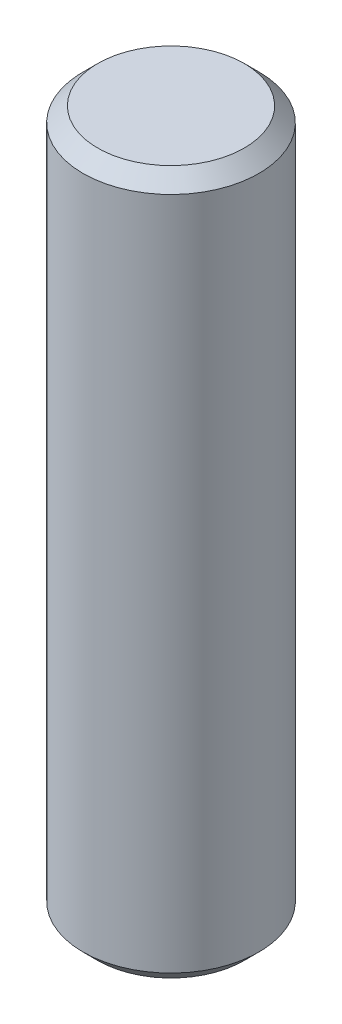
ISO-10303-21;
HEADER;
FILE_DESCRIPTION(('STEP AP214'),'2;1');
FILE_NAME('part.step','',(''),(''),'','','');
FILE_SCHEMA(('AUTOMOTIVE_DESIGN { 1 0 10303 214 1 1 1 1 }'));
ENDSEC;
DATA;
#1=APPLICATION_CONTEXT('core data for automotive mechanical design processes');
#2=APPLICATION_PROTOCOL_DEFINITION('international standard','automotive_design',2000,#1);
#3=PRODUCT_CONTEXT('',#1,'mechanical');
#4=PRODUCT('Part','Part','',(#3));
#5=PRODUCT_RELATED_PRODUCT_CATEGORY('part','',(#4));
#6=PRODUCT_DEFINITION_FORMATION('','',#4);
#7=PRODUCT_DEFINITION_CONTEXT('part definition',#1,'design');
#8=PRODUCT_DEFINITION('design','',#6,#7);
#9=PRODUCT_DEFINITION_SHAPE('','',#8);
#10=(LENGTH_UNIT() NAMED_UNIT(*) SI_UNIT(.MILLI.,.METRE.));
#11=(NAMED_UNIT(*) PLANE_ANGLE_UNIT() SI_UNIT($,.RADIAN.));
#12=(NAMED_UNIT(*) SI_UNIT($,.STERADIAN.) SOLID_ANGLE_UNIT());
#13=UNCERTAINTY_MEASURE_WITH_UNIT(LENGTH_MEASURE(1.E-05),#10,'distance_accuracy_value','');
#14=(GEOMETRIC_REPRESENTATION_CONTEXT(3) GLOBAL_UNCERTAINTY_ASSIGNED_CONTEXT((#13)) GLOBAL_UNIT_ASSIGNED_CONTEXT((#10,
#11,#12)) REPRESENTATION_CONTEXT('',''));
#15=CARTESIAN_POINT('',(0.,0.,0.));
#16=DIRECTION('',(0.,0.,1.));
#17=DIRECTION('',(1.,0.,0.));
#18=AXIS2_PLACEMENT_3D('',#15,#16,#17);
#19=CARTESIAN_POINT('',(0.,0.,0.));
#20=DIRECTION('',(0.,1.,0.));
#21=DIRECTION('',(0.,0.,1.));
#22=AXIS2_PLACEMENT_3D('',#19,#20,#21);
#23=PLANE('',#22);
#24=CARTESIAN_POINT('',(0.,0.,0.));
#25=DIRECTION('',(0.,1.,0.));
#26=DIRECTION('',(0.,0.,1.));
#27=AXIS2_PLACEMENT_3D('',#24,#25,#26);
#28=CIRCLE('',#27,1.25);
#29=CARTESIAN_POINT('',(0.,0.,1.25));
#30=VERTEX_POINT('',#29);
#31=EDGE_CURVE('E40',#30,#30,#28,.F.);
#32=ORIENTED_EDGE('',*,*,#31,.T.);
#33=EDGE_LOOP('',(#32));
#34=FACE_BOUND('',#33,.T.);
#35=ADVANCED_FACE('F33',(#34),#23,.F.);
#36=CARTESIAN_POINT('',(0.,8.63380520315234,0.));
#37=DIRECTION('',(0.,1.,0.));
#38=DIRECTION('',(0.,0.,1.));
#39=AXIS2_PLACEMENT_3D('',#36,#37,#38);
#40=CYLINDRICAL_SURFACE('',#39,1.5);
#41=CARTESIAN_POINT('',(0.,0.25,0.));
#42=DIRECTION('',(0.,1.,0.));
#43=DIRECTION('',(0.,0.,1.));
#44=AXIS2_PLACEMENT_3D('',#41,#42,#43);
#45=CIRCLE('',#44,1.5);
#46=CARTESIAN_POINT('',(0.,0.25,1.5));
#47=VERTEX_POINT('',#46);
#48=EDGE_CURVE('E44',#47,#47,#45,.T.);
#49=ORIENTED_EDGE('',*,*,#48,.T.);
#50=EDGE_LOOP('',(#49));
#51=FACE_BOUND('',#50,.T.);
#52=CARTESIAN_POINT('',(0.,11.75,0.));
#53=DIRECTION('',(0.,-1.,0.));
#54=DIRECTION('',(0.,0.,-1.));
#55=AXIS2_PLACEMENT_3D('',#52,#53,#54);
#56=CIRCLE('',#55,1.5);
#57=CARTESIAN_POINT('',(0.,11.75,-1.5));
#58=VERTEX_POINT('',#57);
#59=EDGE_CURVE('E48',#58,#58,#56,.T.);
#60=ORIENTED_EDGE('',*,*,#59,.T.);
#61=EDGE_LOOP('',(#60));
#62=FACE_BOUND('',#61,.T.);
#63=ADVANCED_FACE('F54',(#51,#62),#40,.T.);
#64=CARTESIAN_POINT('',(1.5,12.,0.));
#65=DIRECTION('',(0.,-1.,0.));
#66=DIRECTION('',(0.,0.,-1.));
#67=AXIS2_PLACEMENT_3D('',#64,#65,#66);
#68=PLANE('',#67);
#69=CARTESIAN_POINT('',(0.,12.,0.));
#70=DIRECTION('',(0.,-1.,0.));
#71=DIRECTION('',(0.,0.,-1.));
#72=AXIS2_PLACEMENT_3D('',#69,#70,#71);
#73=CIRCLE('',#72,1.25);
#74=CARTESIAN_POINT('',(0.,12.,-1.25));
#75=VERTEX_POINT('',#74);
#76=EDGE_CURVE('E10',#75,#75,#73,.F.);
#77=ORIENTED_EDGE('',*,*,#76,.T.);
#78=EDGE_LOOP('',(#77));
#79=FACE_BOUND('',#78,.T.);
#80=ADVANCED_FACE('F62',(#79),#68,.F.);
#81=CARTESIAN_POINT('',(0.,0.25,0.));
#82=DIRECTION('',(0.,1.,0.));
#83=DIRECTION('',(0.,0.,1.));
#84=AXIS2_PLACEMENT_3D('',#81,#82,#83);
#85=CONICAL_SURFACE('',#84,1.5,0.78539816339745);
#86=ORIENTED_EDGE('',*,*,#31,.F.);
#87=EDGE_LOOP('',(#86));
#88=FACE_BOUND('',#87,.T.);
#89=ORIENTED_EDGE('',*,*,#48,.F.);
#90=EDGE_LOOP('',(#89));
#91=FACE_BOUND('',#90,.T.);
#92=ADVANCED_FACE('F58',(#88,#91),#85,.T.);
#93=CARTESIAN_POINT('',(0.,12.,0.));
#94=DIRECTION('',(0.,-1.,0.));
#95=DIRECTION('',(0.,0.,-1.));
#96=AXIS2_PLACEMENT_3D('',#93,#94,#95);
#97=CONICAL_SURFACE('',#96,1.25,0.78539816339745);
#98=ORIENTED_EDGE('',*,*,#59,.F.);
#99=EDGE_LOOP('',(#98));
#100=FACE_BOUND('',#99,.T.);
#101=ORIENTED_EDGE('',*,*,#76,.F.);
#102=EDGE_LOOP('',(#101));
#103=FACE_BOUND('',#102,.T.);
#104=ADVANCED_FACE('F35',(#100,#103),#97,.T.);
#105=CLOSED_SHELL('',(#35,#63,#80,#92,#104));
#106=MANIFOLD_SOLID_BREP('B2',#105);
#107=ADVANCED_BREP_SHAPE_REPRESENTATION('',(#18,#106),#14);
#108=SHAPE_DEFINITION_REPRESENTATION(#9,#107);
ENDSEC;
END-ISO-10303-21;
